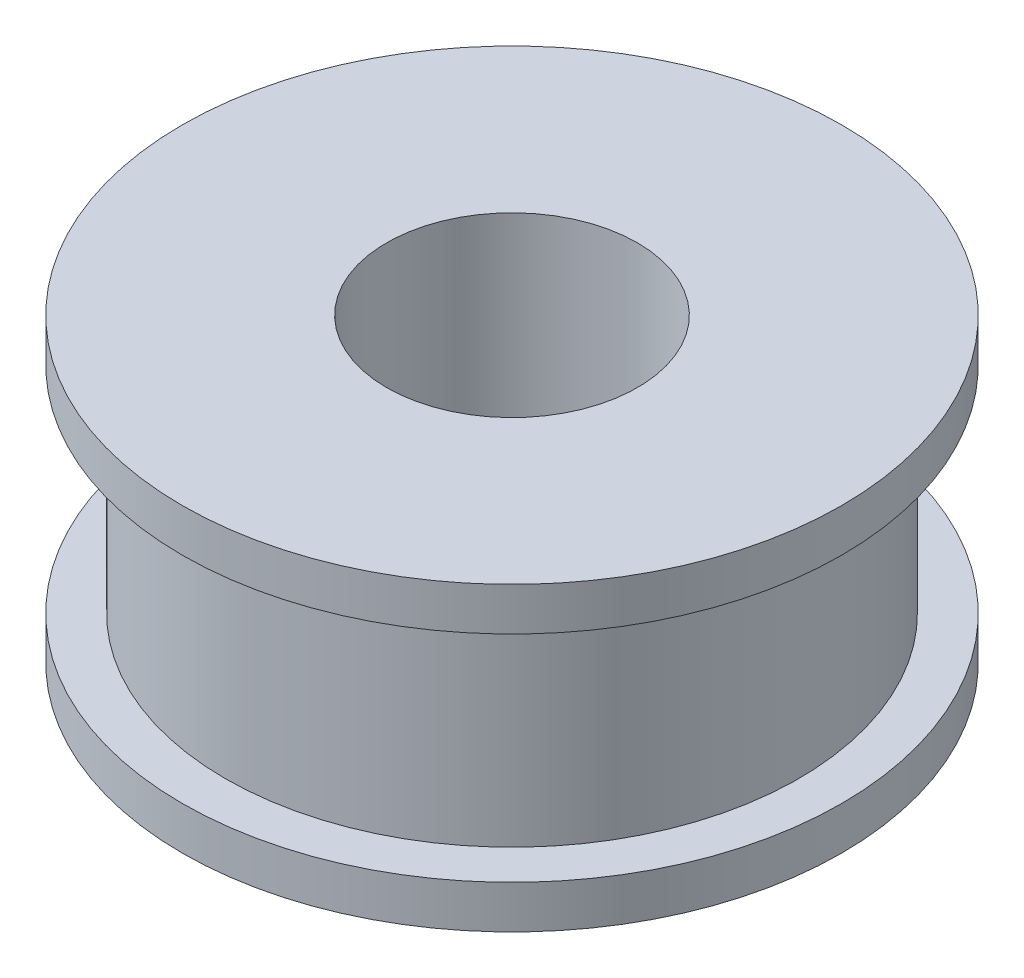
ISO-10303-21;
HEADER;
FILE_DESCRIPTION(('STEP AP214'),'2;1');
FILE_NAME('part.step','',(''),(''),'','','');
FILE_SCHEMA(('AUTOMOTIVE_DESIGN { 1 0 10303 214 1 1 1 1 }'));
ENDSEC;
DATA;
#1=APPLICATION_CONTEXT('core data for automotive mechanical design processes');
#2=APPLICATION_PROTOCOL_DEFINITION('international standard','automotive_design',2000,#1);
#3=PRODUCT_CONTEXT('',#1,'mechanical');
#4=PRODUCT('Part','Part','',(#3));
#5=PRODUCT_RELATED_PRODUCT_CATEGORY('part','',(#4));
#6=PRODUCT_DEFINITION_FORMATION('','',#4);
#7=PRODUCT_DEFINITION_CONTEXT('part definition',#1,'design');
#8=PRODUCT_DEFINITION('design','',#6,#7);
#9=PRODUCT_DEFINITION_SHAPE('','',#8);
#10=(LENGTH_UNIT() NAMED_UNIT(*) SI_UNIT(.MILLI.,.METRE.));
#11=(NAMED_UNIT(*) PLANE_ANGLE_UNIT() SI_UNIT($,.RADIAN.));
#12=(NAMED_UNIT(*) SI_UNIT($,.STERADIAN.) SOLID_ANGLE_UNIT());
#13=UNCERTAINTY_MEASURE_WITH_UNIT(LENGTH_MEASURE(1.E-05),#10,'distance_accuracy_value','');
#14=(GEOMETRIC_REPRESENTATION_CONTEXT(3) GLOBAL_UNCERTAINTY_ASSIGNED_CONTEXT((#13)) GLOBAL_UNIT_ASSIGNED_CONTEXT((#10,
#11,#12)) REPRESENTATION_CONTEXT('',''));
#15=CARTESIAN_POINT('',(0.,0.,0.));
#16=DIRECTION('',(0.,0.,1.));
#17=DIRECTION('',(1.,0.,0.));
#18=AXIS2_PLACEMENT_3D('',#15,#16,#17);
#19=CARTESIAN_POINT('',(0.,3.,0.));
#20=DIRECTION('',(0.,-1.,0.));
#21=DIRECTION('',(0.,0.,-1.));
#22=AXIS2_PLACEMENT_3D('',#19,#20,#21);
#23=CYLINDRICAL_SURFACE('',#22,4.);
#24=CARTESIAN_POINT('',(0.,3.,0.));
#25=DIRECTION('',(0.,1.,0.));
#26=DIRECTION('',(0.,0.,1.));
#27=AXIS2_PLACEMENT_3D('',#24,#25,#26);
#28=CIRCLE('',#27,4.);
#29=CARTESIAN_POINT('',(0.,3.,4.));
#30=VERTEX_POINT('',#29);
#31=EDGE_CURVE('E10',#30,#30,#28,.T.);
#32=ORIENTED_EDGE('',*,*,#31,.F.);
#33=EDGE_LOOP('',(#32));
#34=FACE_BOUND('',#33,.T.);
#35=CARTESIAN_POINT('',(0.,0.,0.));
#36=DIRECTION('',(0.,1.,0.));
#37=DIRECTION('',(0.,0.,1.));
#38=AXIS2_PLACEMENT_3D('',#35,#36,#37);
#39=CIRCLE('',#38,4.);
#40=CARTESIAN_POINT('',(0.,0.,4.));
#41=VERTEX_POINT('',#40);
#42=EDGE_CURVE('E36',#41,#41,#39,.T.);
#43=ORIENTED_EDGE('',*,*,#42,.T.);
#44=EDGE_LOOP('',(#43));
#45=FACE_BOUND('',#44,.T.);
#46=ADVANCED_FACE('F33',(#34,#45),#23,.T.);
#47=CARTESIAN_POINT('',(0.,3.6,0.));
#48=DIRECTION('',(0.,-1.,0.));
#49=DIRECTION('',(0.,0.,-1.));
#50=AXIS2_PLACEMENT_3D('',#47,#48,#49);
#51=CYLINDRICAL_SURFACE('',#50,4.6);
#52=CARTESIAN_POINT('',(0.,3.6,0.));
#53=DIRECTION('',(0.,1.,0.));
#54=DIRECTION('',(0.,0.,1.));
#55=AXIS2_PLACEMENT_3D('',#52,#53,#54);
#56=CIRCLE('',#55,4.6);
#57=CARTESIAN_POINT('',(0.,3.6,4.6));
#58=VERTEX_POINT('',#57);
#59=EDGE_CURVE('E40',#58,#58,#56,.T.);
#60=ORIENTED_EDGE('',*,*,#59,.F.);
#61=EDGE_LOOP('',(#60));
#62=FACE_BOUND('',#61,.T.);
#63=CARTESIAN_POINT('',(0.,3.,0.));
#64=DIRECTION('',(0.,1.,0.));
#65=DIRECTION('',(0.,0.,1.));
#66=AXIS2_PLACEMENT_3D('',#63,#64,#65);
#67=CIRCLE('',#66,4.6);
#68=CARTESIAN_POINT('',(0.,3.,4.6));
#69=VERTEX_POINT('',#68);
#70=EDGE_CURVE('E44',#69,#69,#67,.T.);
#71=ORIENTED_EDGE('',*,*,#70,.T.);
#72=EDGE_LOOP('',(#71));
#73=FACE_BOUND('',#72,.T.);
#74=ADVANCED_FACE('F88',(#62,#73),#51,.T.);
#75=CARTESIAN_POINT('',(0.,3.6,0.));
#76=DIRECTION('',(0.,1.,0.));
#77=DIRECTION('',(0.,0.,1.));
#78=AXIS2_PLACEMENT_3D('',#75,#76,#77);
#79=PLANE('',#78);
#80=CARTESIAN_POINT('',(0.,3.6,0.));
#81=DIRECTION('',(0.,1.,0.));
#82=DIRECTION('',(0.,0.,1.));
#83=AXIS2_PLACEMENT_3D('',#80,#81,#82);
#84=CIRCLE('',#83,1.75);
#85=CARTESIAN_POINT('',(0.,3.6,1.75));
#86=VERTEX_POINT('',#85);
#87=EDGE_CURVE('E53',#86,#86,#84,.T.);
#88=ORIENTED_EDGE('',*,*,#87,.F.);
#89=EDGE_LOOP('',(#88));
#90=FACE_BOUND('',#89,.T.);
#91=ORIENTED_EDGE('',*,*,#59,.T.);
#92=EDGE_LOOP('',(#91));
#93=FACE_BOUND('',#92,.T.);
#94=ADVANCED_FACE('F93',(#90,#93),#79,.T.);
#95=CARTESIAN_POINT('',(0.,3.,0.));
#96=DIRECTION('',(0.,1.,0.));
#97=DIRECTION('',(0.,0.,1.));
#98=AXIS2_PLACEMENT_3D('',#95,#96,#97);
#99=PLANE('',#98);
#100=ORIENTED_EDGE('',*,*,#31,.T.);
#101=EDGE_LOOP('',(#100));
#102=FACE_BOUND('',#101,.T.);
#103=ORIENTED_EDGE('',*,*,#70,.F.);
#104=EDGE_LOOP('',(#103));
#105=FACE_BOUND('',#104,.T.);
#106=ADVANCED_FACE('F74',(#102,#105),#99,.F.);
#107=CARTESIAN_POINT('',(0.,-0.6,0.));
#108=DIRECTION('',(0.,1.,0.));
#109=DIRECTION('',(0.,0.,1.));
#110=AXIS2_PLACEMENT_3D('',#107,#108,#109);
#111=CYLINDRICAL_SURFACE('',#110,4.6);
#112=CARTESIAN_POINT('',(0.,-0.6,0.));
#113=DIRECTION('',(0.,-1.,0.));
#114=DIRECTION('',(0.,0.,-1.));
#115=AXIS2_PLACEMENT_3D('',#112,#113,#114);
#116=CIRCLE('',#115,4.6);
#117=CARTESIAN_POINT('',(0.,-0.6,-4.6));
#118=VERTEX_POINT('',#117);
#119=EDGE_CURVE('E52',#118,#118,#116,.T.);
#120=ORIENTED_EDGE('',*,*,#119,.F.);
#121=EDGE_LOOP('',(#120));
#122=FACE_BOUND('',#121,.T.);
#123=CARTESIAN_POINT('',(0.,0.,0.));
#124=DIRECTION('',(0.,-1.,0.));
#125=DIRECTION('',(0.,0.,-1.));
#126=AXIS2_PLACEMENT_3D('',#123,#124,#125);
#127=CIRCLE('',#126,4.6);
#128=CARTESIAN_POINT('',(0.,0.,-4.6));
#129=VERTEX_POINT('',#128);
#130=EDGE_CURVE('E49',#129,#129,#127,.T.);
#131=ORIENTED_EDGE('',*,*,#130,.T.);
#132=EDGE_LOOP('',(#131));
#133=FACE_BOUND('',#132,.T.);
#134=ADVANCED_FACE('F68',(#122,#133),#111,.T.);
#135=CARTESIAN_POINT('',(0.,-0.6,0.));
#136=DIRECTION('',(0.,-1.,0.));
#137=DIRECTION('',(0.,0.,-1.));
#138=AXIS2_PLACEMENT_3D('',#135,#136,#137);
#139=PLANE('',#138);
#140=CARTESIAN_POINT('',(0.,-0.6,0.));
#141=DIRECTION('',(0.,-1.,0.));
#142=DIRECTION('',(0.,0.,-1.));
#143=AXIS2_PLACEMENT_3D('',#140,#141,#142);
#144=CIRCLE('',#143,1.75);
#145=CARTESIAN_POINT('',(0.,-0.6,-1.75));
#146=VERTEX_POINT('',#145);
#147=EDGE_CURVE('E58',#146,#146,#144,.T.);
#148=ORIENTED_EDGE('',*,*,#147,.F.);
#149=EDGE_LOOP('',(#148));
#150=FACE_BOUND('',#149,.T.);
#151=ORIENTED_EDGE('',*,*,#119,.T.);
#152=EDGE_LOOP('',(#151));
#153=FACE_BOUND('',#152,.T.);
#154=ADVANCED_FACE('F64',(#150,#153),#139,.T.);
#155=CARTESIAN_POINT('',(0.,0.,0.));
#156=DIRECTION('',(0.,-1.,0.));
#157=DIRECTION('',(0.,0.,-1.));
#158=AXIS2_PLACEMENT_3D('',#155,#156,#157);
#159=PLANE('',#158);
#160=ORIENTED_EDGE('',*,*,#42,.F.);
#161=EDGE_LOOP('',(#160));
#162=FACE_BOUND('',#161,.T.);
#163=ORIENTED_EDGE('',*,*,#130,.F.);
#164=EDGE_LOOP('',(#163));
#165=FACE_BOUND('',#164,.T.);
#166=ADVANCED_FACE('F67',(#162,#165),#159,.F.);
#167=CARTESIAN_POINT('',(0.,10.4,0.));
#168=DIRECTION('',(0.,-1.,0.));
#169=DIRECTION('',(0.,0.,-1.));
#170=AXIS2_PLACEMENT_3D('',#167,#168,#169);
#171=CYLINDRICAL_SURFACE('',#170,1.75);
#172=ORIENTED_EDGE('',*,*,#87,.T.);
#173=EDGE_LOOP('',(#172));
#174=FACE_BOUND('',#173,.T.);
#175=ORIENTED_EDGE('',*,*,#147,.T.);
#176=EDGE_LOOP('',(#175));
#177=FACE_BOUND('',#176,.T.);
#178=ADVANCED_FACE('F62',(#174,#177),#171,.F.);
#179=CLOSED_SHELL('',(#46,#74,#94,#106,#134,#154,#166,#178));
#180=MANIFOLD_SOLID_BREP('B2',#179);
#181=ADVANCED_BREP_SHAPE_REPRESENTATION('',(#18,#180),#14);
#182=SHAPE_DEFINITION_REPRESENTATION(#9,#181);
ENDSEC;
END-ISO-10303-21;
